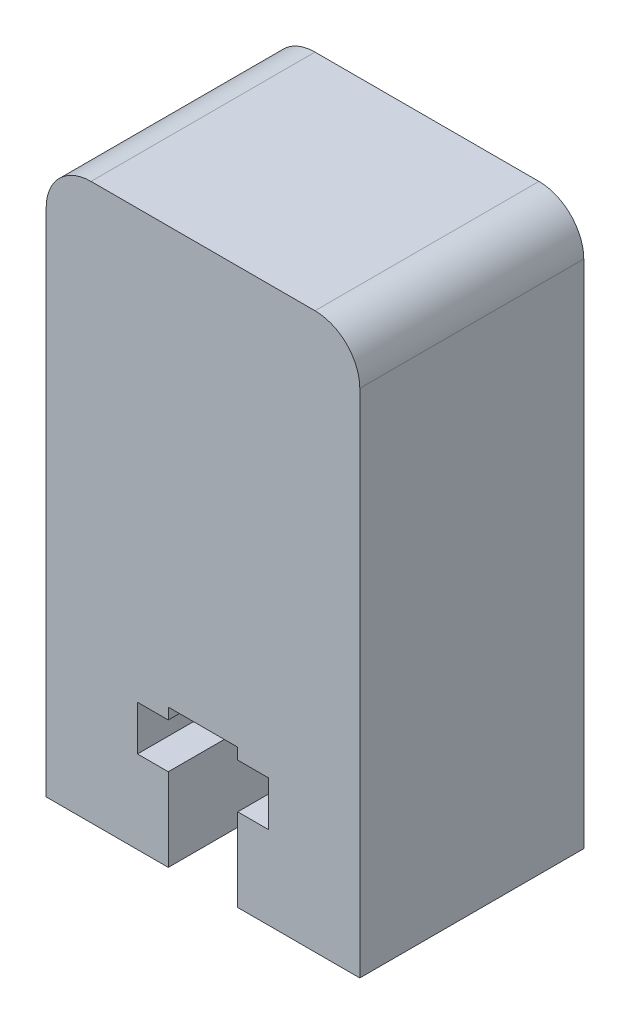
ISO-10303-21;
HEADER;
FILE_DESCRIPTION(('STEP AP214'),'2;1');
FILE_NAME('part.step','',(''),(''),'','','');
FILE_SCHEMA(('AUTOMOTIVE_DESIGN { 1 0 10303 214 1 1 1 1 }'));
ENDSEC;
DATA;
#1=APPLICATION_CONTEXT('core data for automotive mechanical design processes');
#2=APPLICATION_PROTOCOL_DEFINITION('international standard','automotive_design',2000,#1);
#3=PRODUCT_CONTEXT('',#1,'mechanical');
#4=PRODUCT('Part','Part','',(#3));
#5=PRODUCT_RELATED_PRODUCT_CATEGORY('part','',(#4));
#6=PRODUCT_DEFINITION_FORMATION('','',#4);
#7=PRODUCT_DEFINITION_CONTEXT('part definition',#1,'design');
#8=PRODUCT_DEFINITION('design','',#6,#7);
#9=PRODUCT_DEFINITION_SHAPE('','',#8);
#10=(LENGTH_UNIT() NAMED_UNIT(*) SI_UNIT(.MILLI.,.METRE.));
#11=(NAMED_UNIT(*) PLANE_ANGLE_UNIT() SI_UNIT($,.RADIAN.));
#12=(NAMED_UNIT(*) SI_UNIT($,.STERADIAN.) SOLID_ANGLE_UNIT());
#13=UNCERTAINTY_MEASURE_WITH_UNIT(LENGTH_MEASURE(1.E-05),#10,'distance_accuracy_value','');
#14=(GEOMETRIC_REPRESENTATION_CONTEXT(3) GLOBAL_UNCERTAINTY_ASSIGNED_CONTEXT((#13)) GLOBAL_UNIT_ASSIGNED_CONTEXT((#10,
#11,#12)) REPRESENTATION_CONTEXT('',''));
#15=CARTESIAN_POINT('',(0.,0.,0.));
#16=DIRECTION('',(0.,0.,1.));
#17=DIRECTION('',(1.,0.,0.));
#18=AXIS2_PLACEMENT_3D('',#15,#16,#17);
#19=CARTESIAN_POINT('',(-46.4760064902337,4.00000000000001,10.));
#20=DIRECTION('',(0.,1.,0.));
#21=DIRECTION('',(-1.,0.,0.));
#22=AXIS2_PLACEMENT_3D('',#19,#20,#21);
#23=PLANE('',#22);
#24=DIRECTION('',(1.,0.,0.));
#25=VECTOR('',#24,1.);
#26=CARTESIAN_POINT('',(-46.4760064902337,4.00000000000001,10.));
#27=LINE('',#26,#25);
#28=CARTESIAN_POINT('',(-51.9260064902337,4.00000000000001,10.));
#29=VERTEX_POINT('',#28);
#30=CARTESIAN_POINT('',(-46.4760064902337,4.00000000000001,10.));
#31=VERTEX_POINT('',#30);
#32=EDGE_CURVE('E112',#29,#31,#27,.T.);
#33=ORIENTED_EDGE('',*,*,#32,.F.);
#34=DIRECTION('',(0.,0.,1.));
#35=VECTOR('',#34,1.);
#36=CARTESIAN_POINT('',(-51.9260064902337,4.00000000000001,0.));
#37=LINE('',#36,#35);
#38=CARTESIAN_POINT('',(-51.9260064902337,4.00000000000001,0.));
#39=VERTEX_POINT('',#38);
#40=EDGE_CURVE('E138',#39,#29,#37,.T.);
#41=ORIENTED_EDGE('',*,*,#40,.F.);
#42=DIRECTION('',(1.,0.,0.));
#43=VECTOR('',#42,1.);
#44=CARTESIAN_POINT('',(-46.4760064902337,4.00000000000001,0.));
#45=LINE('',#44,#43);
#46=CARTESIAN_POINT('',(-46.4760064902337,4.00000000000001,0.));
#47=VERTEX_POINT('',#46);
#48=EDGE_CURVE('E140',#39,#47,#45,.T.);
#49=ORIENTED_EDGE('',*,*,#48,.T.);
#50=DIRECTION('',(0.,0.,-1.));
#51=VECTOR('',#50,1.);
#52=CARTESIAN_POINT('',(-46.4760064902337,4.00000000000001,10.));
#53=LINE('',#52,#51);
#54=EDGE_CURVE('E125',#31,#47,#53,.T.);
#55=ORIENTED_EDGE('',*,*,#54,.F.);
#56=EDGE_LOOP('',(#33,#41,#49,#55));
#57=FACE_BOUND('',#56,.T.);
#58=ADVANCED_FACE('F34',(#57),#23,.F.);
#59=CARTESIAN_POINT('',(-58.4760064902337,26.8,10.));
#60=DIRECTION('',(0.,0.,-1.));
#61=DIRECTION('',(-1.,0.,0.));
#62=AXIS2_PLACEMENT_3D('',#59,#60,#61);
#63=CYLINDRICAL_SURFACE('',#62,2.);
#64=CARTESIAN_POINT('',(-58.4760064902337,26.8,0.));
#65=DIRECTION('',(0.,0.,1.));
#66=DIRECTION('',(-1.,0.,0.));
#67=AXIS2_PLACEMENT_3D('',#64,#65,#66);
#68=CIRCLE('',#67,2.);
#69=CARTESIAN_POINT('',(-58.4760064902336,28.8,0.));
#70=VERTEX_POINT('',#69);
#71=CARTESIAN_POINT('',(-60.4760064902337,26.8,0.));
#72=VERTEX_POINT('',#71);
#73=EDGE_CURVE('E134',#70,#72,#68,.T.);
#74=ORIENTED_EDGE('',*,*,#73,.T.);
#75=DIRECTION('',(0.,0.,-1.));
#76=VECTOR('',#75,1.);
#77=CARTESIAN_POINT('',(-60.4760064902337,26.8,10.));
#78=LINE('',#77,#76);
#79=CARTESIAN_POINT('',(-60.4760064902337,26.8,10.));
#80=VERTEX_POINT('',#79);
#81=EDGE_CURVE('E11',#80,#72,#78,.T.);
#82=ORIENTED_EDGE('',*,*,#81,.F.);
#83=CARTESIAN_POINT('',(-58.4760064902337,26.8,10.));
#84=DIRECTION('',(0.,0.,1.));
#85=DIRECTION('',(-1.,0.,0.));
#86=AXIS2_PLACEMENT_3D('',#83,#84,#85);
#87=CIRCLE('',#86,2.);
#88=CARTESIAN_POINT('',(-58.4760064902336,28.8,10.));
#89=VERTEX_POINT('',#88);
#90=EDGE_CURVE('E148',#89,#80,#87,.T.);
#91=ORIENTED_EDGE('',*,*,#90,.F.);
#92=DIRECTION('',(0.,0.,-1.));
#93=VECTOR('',#92,1.);
#94=CARTESIAN_POINT('',(-58.4760064902336,28.8,10.));
#95=LINE('',#94,#93);
#96=EDGE_CURVE('E130',#89,#70,#95,.T.);
#97=ORIENTED_EDGE('',*,*,#96,.T.);
#98=EDGE_LOOP('',(#74,#82,#91,#97));
#99=FACE_BOUND('',#98,.T.);
#100=ADVANCED_FACE('F36',(#99),#63,.T.);
#101=CARTESIAN_POINT('',(-60.4760064902337,4.00000000000001,10.));
#102=DIRECTION('',(1.,0.,0.));
#103=DIRECTION('',(0.,0.,-1.));
#104=AXIS2_PLACEMENT_3D('',#101,#102,#103);
#105=PLANE('',#104);
#106=DIRECTION('',(0.,-1.,0.));
#107=VECTOR('',#106,1.);
#108=CARTESIAN_POINT('',(-60.4760064902337,4.00000000000001,0.));
#109=LINE('',#108,#107);
#110=CARTESIAN_POINT('',(-60.4760064902337,4.00000000000001,0.));
#111=VERTEX_POINT('',#110);
#112=EDGE_CURVE('E137',#72,#111,#109,.T.);
#113=ORIENTED_EDGE('',*,*,#112,.T.);
#114=DIRECTION('',(0.,0.,-1.));
#115=VECTOR('',#114,1.);
#116=CARTESIAN_POINT('',(-60.4760064902337,4.00000000000001,10.));
#117=LINE('',#116,#115);
#118=CARTESIAN_POINT('',(-60.4760064902337,4.00000000000001,10.));
#119=VERTEX_POINT('',#118);
#120=EDGE_CURVE('E42',#119,#111,#117,.T.);
#121=ORIENTED_EDGE('',*,*,#120,.F.);
#122=DIRECTION('',(0.,-1.,0.));
#123=VECTOR('',#122,1.);
#124=CARTESIAN_POINT('',(-60.4760064902337,4.00000000000001,10.));
#125=LINE('',#124,#123);
#126=EDGE_CURVE('E93',#80,#119,#125,.T.);
#127=ORIENTED_EDGE('',*,*,#126,.F.);
#128=ORIENTED_EDGE('',*,*,#81,.T.);
#129=EDGE_LOOP('',(#113,#121,#127,#128));
#130=FACE_BOUND('',#129,.T.);
#131=ADVANCED_FACE('F346',(#130),#105,.F.);
#132=CARTESIAN_POINT('',(-55.0260064902337,4.00000000000001,0.));
#133=VERTEX_POINT('',#132);
#134=EDGE_CURVE('E141',#111,#133,#45,.T.);
#135=ORIENTED_EDGE('',*,*,#134,.T.);
#136=DIRECTION('',(0.,0.,1.));
#137=VECTOR('',#136,1.);
#138=CARTESIAN_POINT('',(-55.0260064902337,4.00000000000001,0.));
#139=LINE('',#138,#137);
#140=CARTESIAN_POINT('',(-55.0260064902337,4.00000000000001,10.));
#141=VERTEX_POINT('',#140);
#142=EDGE_CURVE('E220',#133,#141,#139,.T.);
#143=ORIENTED_EDGE('',*,*,#142,.T.);
#144=EDGE_CURVE('E116',#119,#141,#27,.T.);
#145=ORIENTED_EDGE('',*,*,#144,.F.);
#146=ORIENTED_EDGE('',*,*,#120,.T.);
#147=EDGE_LOOP('',(#135,#143,#145,#146));
#148=FACE_BOUND('',#147,.T.);
#149=ADVANCED_FACE('F155',(#148),#23,.F.);
#150=CARTESIAN_POINT('',(-46.4760064902337,4.00000000000001,10.));
#151=DIRECTION('',(-1.,0.,0.));
#152=DIRECTION('',(0.,-1.,0.));
#153=AXIS2_PLACEMENT_3D('',#150,#151,#152);
#154=PLANE('',#153);
#155=DIRECTION('',(0.,1.,0.));
#156=VECTOR('',#155,1.);
#157=CARTESIAN_POINT('',(-46.4760064902337,4.00000000000001,0.));
#158=LINE('',#157,#156);
#159=CARTESIAN_POINT('',(-46.4760064902337,26.8,0.));
#160=VERTEX_POINT('',#159);
#161=EDGE_CURVE('E122',#47,#160,#158,.T.);
#162=ORIENTED_EDGE('',*,*,#161,.T.);
#163=DIRECTION('',(0.,0.,-1.));
#164=VECTOR('',#163,1.);
#165=CARTESIAN_POINT('',(-46.4760064902337,26.8,10.));
#166=LINE('',#165,#164);
#167=CARTESIAN_POINT('',(-46.4760064902337,26.8,10.));
#168=VERTEX_POINT('',#167);
#169=EDGE_CURVE('E119',#168,#160,#166,.T.);
#170=ORIENTED_EDGE('',*,*,#169,.F.);
#171=DIRECTION('',(0.,1.,0.));
#172=VECTOR('',#171,1.);
#173=CARTESIAN_POINT('',(-46.4760064902337,4.00000000000001,10.));
#174=LINE('',#173,#172);
#175=EDGE_CURVE('E103',#31,#168,#174,.T.);
#176=ORIENTED_EDGE('',*,*,#175,.F.);
#177=ORIENTED_EDGE('',*,*,#54,.T.);
#178=EDGE_LOOP('',(#162,#170,#176,#177));
#179=FACE_BOUND('',#178,.T.);
#180=ADVANCED_FACE('F120',(#179),#154,.F.);
#181=CARTESIAN_POINT('',(-48.4760064902337,26.8,10.));
#182=DIRECTION('',(0.,0.,-1.));
#183=DIRECTION('',(-1.,0.,0.));
#184=AXIS2_PLACEMENT_3D('',#181,#182,#183);
#185=CYLINDRICAL_SURFACE('',#184,2.);
#186=CARTESIAN_POINT('',(-48.4760064902337,26.8,0.));
#187=DIRECTION('',(0.,0.,1.));
#188=DIRECTION('',(1.,0.,0.));
#189=AXIS2_PLACEMENT_3D('',#186,#187,#188);
#190=CIRCLE('',#189,2.);
#191=CARTESIAN_POINT('',(-48.4760064902337,28.8,0.));
#192=VERTEX_POINT('',#191);
#193=EDGE_CURVE('E145',#160,#192,#190,.T.);
#194=ORIENTED_EDGE('',*,*,#193,.T.);
#195=DIRECTION('',(0.,0.,-1.));
#196=VECTOR('',#195,1.);
#197=CARTESIAN_POINT('',(-48.4760064902337,28.8,10.));
#198=LINE('',#197,#196);
#199=CARTESIAN_POINT('',(-48.4760064902337,28.8,10.));
#200=VERTEX_POINT('',#199);
#201=EDGE_CURVE('E126',#200,#192,#198,.T.);
#202=ORIENTED_EDGE('',*,*,#201,.F.);
#203=CARTESIAN_POINT('',(-48.4760064902337,26.8,10.));
#204=DIRECTION('',(0.,0.,1.));
#205=DIRECTION('',(1.,0.,0.));
#206=AXIS2_PLACEMENT_3D('',#203,#204,#205);
#207=CIRCLE('',#206,2.);
#208=EDGE_CURVE('E108',#168,#200,#207,.T.);
#209=ORIENTED_EDGE('',*,*,#208,.F.);
#210=ORIENTED_EDGE('',*,*,#169,.T.);
#211=EDGE_LOOP('',(#194,#202,#209,#210));
#212=FACE_BOUND('',#211,.T.);
#213=ADVANCED_FACE('F128',(#212),#185,.T.);
#214=CARTESIAN_POINT('',(-48.4760064902337,28.8,10.));
#215=DIRECTION('',(0.,-1.,0.));
#216=DIRECTION('',(1.,0.,0.));
#217=AXIS2_PLACEMENT_3D('',#214,#215,#216);
#218=PLANE('',#217);
#219=DIRECTION('',(-1.,0.,0.));
#220=VECTOR('',#219,1.);
#221=CARTESIAN_POINT('',(-48.4760064902337,28.8,0.));
#222=LINE('',#221,#220);
#223=EDGE_CURVE('E85',#192,#70,#222,.T.);
#224=ORIENTED_EDGE('',*,*,#223,.T.);
#225=ORIENTED_EDGE('',*,*,#96,.F.);
#226=DIRECTION('',(-1.,0.,0.));
#227=VECTOR('',#226,1.);
#228=CARTESIAN_POINT('',(-48.4760064902337,28.8,10.));
#229=LINE('',#228,#227);
#230=EDGE_CURVE('E58',#200,#89,#229,.T.);
#231=ORIENTED_EDGE('',*,*,#230,.F.);
#232=ORIENTED_EDGE('',*,*,#201,.T.);
#233=EDGE_LOOP('',(#224,#225,#231,#232));
#234=FACE_BOUND('',#233,.T.);
#235=ADVANCED_FACE('F358',(#234),#218,.F.);
#236=CARTESIAN_POINT('',(-58.4760064902337,26.8,10.));
#237=DIRECTION('',(0.,0.,-1.));
#238=DIRECTION('',(-1.,0.,0.));
#239=AXIS2_PLACEMENT_3D('',#236,#237,#238);
#240=PLANE('',#239);
#241=DIRECTION('',(1.,0.,0.));
#242=VECTOR('',#241,1.);
#243=CARTESIAN_POINT('',(-50.5510064902337,7.70000000000001,10.));
#244=LINE('',#243,#242);
#245=CARTESIAN_POINT('',(-51.9260064902337,7.70000000000001,10.));
#246=VERTEX_POINT('',#245);
#247=CARTESIAN_POINT('',(-50.5510064902337,7.70000000000001,10.));
#248=VERTEX_POINT('',#247);
#249=EDGE_CURVE('E187',#246,#248,#244,.T.);
#250=ORIENTED_EDGE('',*,*,#249,.F.);
#251=DIRECTION('',(0.,1.,0.));
#252=VECTOR('',#251,1.);
#253=CARTESIAN_POINT('',(-51.9260064902337,4.00000000000001,10.));
#254=LINE('',#253,#252);
#255=EDGE_CURVE('E184',#29,#246,#254,.T.);
#256=ORIENTED_EDGE('',*,*,#255,.F.);
#257=ORIENTED_EDGE('',*,*,#32,.T.);
#258=ORIENTED_EDGE('',*,*,#175,.T.);
#259=ORIENTED_EDGE('',*,*,#208,.T.);
#260=ORIENTED_EDGE('',*,*,#230,.T.);
#261=ORIENTED_EDGE('',*,*,#90,.T.);
#262=ORIENTED_EDGE('',*,*,#126,.T.);
#263=ORIENTED_EDGE('',*,*,#144,.T.);
#264=DIRECTION('',(0.,-1.,0.));
#265=VECTOR('',#264,1.);
#266=CARTESIAN_POINT('',(-55.0260064902337,4.00000000000001,10.));
#267=LINE('',#266,#265);
#268=CARTESIAN_POINT('',(-55.0260064902337,7.70000000000001,10.));
#269=VERTEX_POINT('',#268);
#270=EDGE_CURVE('E214',#269,#141,#267,.T.);
#271=ORIENTED_EDGE('',*,*,#270,.F.);
#272=DIRECTION('',(1.,0.,0.));
#273=VECTOR('',#272,1.);
#274=CARTESIAN_POINT('',(-55.0260064902337,7.70000000000001,10.));
#275=LINE('',#274,#273);
#276=CARTESIAN_POINT('',(-56.4010064902337,7.70000000000001,10.));
#277=VERTEX_POINT('',#276);
#278=EDGE_CURVE('E211',#277,#269,#275,.T.);
#279=ORIENTED_EDGE('',*,*,#278,.F.);
#280=DIRECTION('',(0.,-1.,0.));
#281=VECTOR('',#280,1.);
#282=CARTESIAN_POINT('',(-56.4010064902337,7.70000000000001,10.));
#283=LINE('',#282,#281);
#284=CARTESIAN_POINT('',(-56.4010064902337,9.70000000000001,10.));
#285=VERTEX_POINT('',#284);
#286=EDGE_CURVE('E208',#285,#277,#283,.T.);
#287=ORIENTED_EDGE('',*,*,#286,.F.);
#288=DIRECTION('',(-1.,0.,0.));
#289=VECTOR('',#288,1.);
#290=CARTESIAN_POINT('',(-55.0260064902337,9.70000000000001,10.));
#291=LINE('',#290,#289);
#292=CARTESIAN_POINT('',(-55.0260064902337,9.70000000000001,10.));
#293=VERTEX_POINT('',#292);
#294=EDGE_CURVE('E205',#293,#285,#291,.T.);
#295=ORIENTED_EDGE('',*,*,#294,.F.);
#296=DIRECTION('',(0.,-1.,0.));
#297=VECTOR('',#296,1.);
#298=CARTESIAN_POINT('',(-55.0260064902337,9.70000000000001,10.));
#299=LINE('',#298,#297);
#300=CARTESIAN_POINT('',(-55.0260064902337,10.2,10.));
#301=VERTEX_POINT('',#300);
#302=EDGE_CURVE('E202',#301,#293,#299,.T.);
#303=ORIENTED_EDGE('',*,*,#302,.F.);
#304=DIRECTION('',(-1.,0.,0.));
#305=VECTOR('',#304,1.);
#306=CARTESIAN_POINT('',(-51.9260064902337,10.2,10.));
#307=LINE('',#306,#305);
#308=CARTESIAN_POINT('',(-51.9260064902337,10.2,10.));
#309=VERTEX_POINT('',#308);
#310=EDGE_CURVE('E199',#309,#301,#307,.T.);
#311=ORIENTED_EDGE('',*,*,#310,.F.);
#312=DIRECTION('',(0.,1.,0.));
#313=VECTOR('',#312,1.);
#314=CARTESIAN_POINT('',(-51.9260064902337,9.70000000000001,10.));
#315=LINE('',#314,#313);
#316=CARTESIAN_POINT('',(-51.9260064902337,9.70000000000001,10.));
#317=VERTEX_POINT('',#316);
#318=EDGE_CURVE('E196',#317,#309,#315,.T.);
#319=ORIENTED_EDGE('',*,*,#318,.F.);
#320=DIRECTION('',(-1.,0.,0.));
#321=VECTOR('',#320,1.);
#322=CARTESIAN_POINT('',(-50.5510064902337,9.70000000000001,10.));
#323=LINE('',#322,#321);
#324=CARTESIAN_POINT('',(-50.5510064902337,9.70000000000001,10.));
#325=VERTEX_POINT('',#324);
#326=EDGE_CURVE('E193',#325,#317,#323,.T.);
#327=ORIENTED_EDGE('',*,*,#326,.F.);
#328=DIRECTION('',(0.,1.,0.));
#329=VECTOR('',#328,1.);
#330=CARTESIAN_POINT('',(-50.5510064902337,7.70000000000001,10.));
#331=LINE('',#330,#329);
#332=EDGE_CURVE('E190',#248,#325,#331,.T.);
#333=ORIENTED_EDGE('',*,*,#332,.F.);
#334=EDGE_LOOP('',(#250,#256,#257,#258,#259,#260,#261,#262,#263,#271,#279,#287,#295,#303,#311,
#319,#327,#333));
#335=FACE_BOUND('',#334,.T.);
#336=ADVANCED_FACE('F106',(#335),#240,.F.);
#337=CARTESIAN_POINT('',(-58.4760064902337,26.8,0.));
#338=DIRECTION('',(0.,0.,-1.));
#339=DIRECTION('',(-1.,0.,0.));
#340=AXIS2_PLACEMENT_3D('',#337,#338,#339);
#341=PLANE('',#340);
#342=DIRECTION('',(0.,1.,0.));
#343=VECTOR('',#342,1.);
#344=CARTESIAN_POINT('',(-51.9260064902337,4.00000000000001,0.));
#345=LINE('',#344,#343);
#346=CARTESIAN_POINT('',(-51.9260064902337,7.70000000000001,0.));
#347=VERTEX_POINT('',#346);
#348=EDGE_CURVE('E217',#39,#347,#345,.T.);
#349=ORIENTED_EDGE('',*,*,#348,.T.);
#350=DIRECTION('',(1.,0.,0.));
#351=VECTOR('',#350,1.);
#352=CARTESIAN_POINT('',(-50.5510064902337,7.70000000000001,0.));
#353=LINE('',#352,#351);
#354=CARTESIAN_POINT('',(-50.5510064902337,7.70000000000001,0.));
#355=VERTEX_POINT('',#354);
#356=EDGE_CURVE('E303',#347,#355,#353,.T.);
#357=ORIENTED_EDGE('',*,*,#356,.T.);
#358=DIRECTION('',(0.,1.,0.));
#359=VECTOR('',#358,1.);
#360=CARTESIAN_POINT('',(-50.5510064902337,7.70000000000001,0.));
#361=LINE('',#360,#359);
#362=CARTESIAN_POINT('',(-50.5510064902337,9.70000000000001,0.));
#363=VERTEX_POINT('',#362);
#364=EDGE_CURVE('E49',#355,#363,#361,.T.);
#365=ORIENTED_EDGE('',*,*,#364,.T.);
#366=DIRECTION('',(-1.,0.,0.));
#367=VECTOR('',#366,1.);
#368=CARTESIAN_POINT('',(-50.5510064902337,9.70000000000001,0.));
#369=LINE('',#368,#367);
#370=CARTESIAN_POINT('',(-51.9260064902337,9.70000000000001,0.));
#371=VERTEX_POINT('',#370);
#372=EDGE_CURVE('E310',#363,#371,#369,.T.);
#373=ORIENTED_EDGE('',*,*,#372,.T.);
#374=DIRECTION('',(0.,1.,0.));
#375=VECTOR('',#374,1.);
#376=CARTESIAN_POINT('',(-51.9260064902337,9.70000000000001,0.));
#377=LINE('',#376,#375);
#378=CARTESIAN_POINT('',(-51.9260064902337,10.2,0.));
#379=VERTEX_POINT('',#378);
#380=EDGE_CURVE('E313',#371,#379,#377,.T.);
#381=ORIENTED_EDGE('',*,*,#380,.T.);
#382=DIRECTION('',(-1.,0.,0.));
#383=VECTOR('',#382,1.);
#384=CARTESIAN_POINT('',(-51.9260064902337,10.2,0.));
#385=LINE('',#384,#383);
#386=CARTESIAN_POINT('',(-55.0260064902337,10.2,0.));
#387=VERTEX_POINT('',#386);
#388=EDGE_CURVE('E316',#379,#387,#385,.T.);
#389=ORIENTED_EDGE('',*,*,#388,.T.);
#390=DIRECTION('',(0.,-1.,0.));
#391=VECTOR('',#390,1.);
#392=CARTESIAN_POINT('',(-55.0260064902337,9.70000000000001,0.));
#393=LINE('',#392,#391);
#394=CARTESIAN_POINT('',(-55.0260064902337,9.70000000000001,0.));
#395=VERTEX_POINT('',#394);
#396=EDGE_CURVE('E319',#387,#395,#393,.T.);
#397=ORIENTED_EDGE('',*,*,#396,.T.);
#398=DIRECTION('',(-1.,0.,0.));
#399=VECTOR('',#398,1.);
#400=CARTESIAN_POINT('',(-55.0260064902337,9.70000000000001,0.));
#401=LINE('',#400,#399);
#402=CARTESIAN_POINT('',(-56.4010064902337,9.70000000000001,0.));
#403=VERTEX_POINT('',#402);
#404=EDGE_CURVE('E322',#395,#403,#401,.T.);
#405=ORIENTED_EDGE('',*,*,#404,.T.);
#406=DIRECTION('',(0.,-1.,0.));
#407=VECTOR('',#406,1.);
#408=CARTESIAN_POINT('',(-56.4010064902337,7.70000000000001,0.));
#409=LINE('',#408,#407);
#410=CARTESIAN_POINT('',(-56.4010064902337,7.70000000000001,0.));
#411=VERTEX_POINT('',#410);
#412=EDGE_CURVE('E180',#403,#411,#409,.T.);
#413=ORIENTED_EDGE('',*,*,#412,.T.);
#414=DIRECTION('',(1.,0.,0.));
#415=VECTOR('',#414,1.);
#416=CARTESIAN_POINT('',(-55.0260064902337,7.70000000000001,0.));
#417=LINE('',#416,#415);
#418=CARTESIAN_POINT('',(-55.0260064902337,7.70000000000001,0.));
#419=VERTEX_POINT('',#418);
#420=EDGE_CURVE('E170',#411,#419,#417,.T.);
#421=ORIENTED_EDGE('',*,*,#420,.T.);
#422=DIRECTION('',(0.,-1.,0.));
#423=VECTOR('',#422,1.);
#424=CARTESIAN_POINT('',(-55.0260064902337,4.00000000000001,0.));
#425=LINE('',#424,#423);
#426=EDGE_CURVE('E166',#419,#133,#425,.T.);
#427=ORIENTED_EDGE('',*,*,#426,.T.);
#428=ORIENTED_EDGE('',*,*,#134,.F.);
#429=ORIENTED_EDGE('',*,*,#112,.F.);
#430=ORIENTED_EDGE('',*,*,#73,.F.);
#431=ORIENTED_EDGE('',*,*,#223,.F.);
#432=ORIENTED_EDGE('',*,*,#193,.F.);
#433=ORIENTED_EDGE('',*,*,#161,.F.);
#434=ORIENTED_EDGE('',*,*,#48,.F.);
#435=EDGE_LOOP('',(#349,#357,#365,#373,#381,#389,#397,#405,#413,#421,#427,#428,#429,#430,#431,
#432,#433,#434));
#436=FACE_BOUND('',#435,.T.);
#437=ADVANCED_FACE('F162',(#436),#341,.T.);
#438=CARTESIAN_POINT('',(-51.9260064902337,4.00000000000001,0.));
#439=DIRECTION('',(1.,0.,0.));
#440=DIRECTION('',(0.,0.,-1.));
#441=AXIS2_PLACEMENT_3D('',#438,#439,#440);
#442=PLANE('',#441);
#443=ORIENTED_EDGE('',*,*,#255,.T.);
#444=DIRECTION('',(0.,0.,1.));
#445=VECTOR('',#444,1.);
#446=CARTESIAN_POINT('',(-51.9260064902337,7.70000000000001,0.));
#447=LINE('',#446,#445);
#448=EDGE_CURVE('E175',#347,#246,#447,.T.);
#449=ORIENTED_EDGE('',*,*,#448,.F.);
#450=ORIENTED_EDGE('',*,*,#348,.F.);
#451=ORIENTED_EDGE('',*,*,#40,.T.);
#452=EDGE_LOOP('',(#443,#449,#450,#451));
#453=FACE_BOUND('',#452,.T.);
#454=ADVANCED_FACE('F299',(#453),#442,.F.);
#455=CARTESIAN_POINT('',(-55.0260064902337,4.00000000000001,0.));
#456=DIRECTION('',(-1.,0.,0.));
#457=DIRECTION('',(0.,0.,1.));
#458=AXIS2_PLACEMENT_3D('',#455,#456,#457);
#459=PLANE('',#458);
#460=ORIENTED_EDGE('',*,*,#270,.T.);
#461=ORIENTED_EDGE('',*,*,#142,.F.);
#462=ORIENTED_EDGE('',*,*,#426,.F.);
#463=DIRECTION('',(0.,0.,1.));
#464=VECTOR('',#463,1.);
#465=CARTESIAN_POINT('',(-55.0260064902337,7.70000000000001,0.));
#466=LINE('',#465,#464);
#467=EDGE_CURVE('E222',#419,#269,#466,.T.);
#468=ORIENTED_EDGE('',*,*,#467,.T.);
#469=EDGE_LOOP('',(#460,#461,#462,#468));
#470=FACE_BOUND('',#469,.T.);
#471=ADVANCED_FACE('F331',(#470),#459,.F.);
#472=CARTESIAN_POINT('',(-55.0260064902337,7.70000000000001,0.));
#473=DIRECTION('',(0.,-1.,0.));
#474=DIRECTION('',(0.,0.,-1.));
#475=AXIS2_PLACEMENT_3D('',#472,#473,#474);
#476=PLANE('',#475);
#477=ORIENTED_EDGE('',*,*,#278,.T.);
#478=ORIENTED_EDGE('',*,*,#467,.F.);
#479=ORIENTED_EDGE('',*,*,#420,.F.);
#480=DIRECTION('',(0.,0.,1.));
#481=VECTOR('',#480,1.);
#482=CARTESIAN_POINT('',(-56.4010064902337,7.70000000000001,0.));
#483=LINE('',#482,#481);
#484=EDGE_CURVE('E224',#411,#277,#483,.T.);
#485=ORIENTED_EDGE('',*,*,#484,.T.);
#486=EDGE_LOOP('',(#477,#478,#479,#485));
#487=FACE_BOUND('',#486,.T.);
#488=ADVANCED_FACE('F330',(#487),#476,.F.);
#489=CARTESIAN_POINT('',(-56.4010064902337,7.70000000000001,0.));
#490=DIRECTION('',(-1.,0.,0.));
#491=DIRECTION('',(0.,0.,1.));
#492=AXIS2_PLACEMENT_3D('',#489,#490,#491);
#493=PLANE('',#492);
#494=ORIENTED_EDGE('',*,*,#286,.T.);
#495=ORIENTED_EDGE('',*,*,#484,.F.);
#496=ORIENTED_EDGE('',*,*,#412,.F.);
#497=DIRECTION('',(0.,0.,1.));
#498=VECTOR('',#497,1.);
#499=CARTESIAN_POINT('',(-56.4010064902337,9.70000000000001,0.));
#500=LINE('',#499,#498);
#501=EDGE_CURVE('E227',#403,#285,#500,.T.);
#502=ORIENTED_EDGE('',*,*,#501,.T.);
#503=EDGE_LOOP('',(#494,#495,#496,#502));
#504=FACE_BOUND('',#503,.T.);
#505=ADVANCED_FACE('F327',(#504),#493,.F.);
#506=CARTESIAN_POINT('',(-55.0260064902337,9.70000000000001,0.));
#507=DIRECTION('',(0.,1.,0.));
#508=DIRECTION('',(0.,0.,1.));
#509=AXIS2_PLACEMENT_3D('',#506,#507,#508);
#510=PLANE('',#509);
#511=ORIENTED_EDGE('',*,*,#294,.T.);
#512=ORIENTED_EDGE('',*,*,#501,.F.);
#513=ORIENTED_EDGE('',*,*,#404,.F.);
#514=DIRECTION('',(0.,0.,1.));
#515=VECTOR('',#514,1.);
#516=CARTESIAN_POINT('',(-55.0260064902337,9.70000000000001,0.));
#517=LINE('',#516,#515);
#518=EDGE_CURVE('E230',#395,#293,#517,.T.);
#519=ORIENTED_EDGE('',*,*,#518,.T.);
#520=EDGE_LOOP('',(#511,#512,#513,#519));
#521=FACE_BOUND('',#520,.T.);
#522=ADVANCED_FACE('F390',(#521),#510,.F.);
#523=CARTESIAN_POINT('',(-55.0260064902337,9.70000000000001,0.));
#524=DIRECTION('',(-1.,0.,0.));
#525=DIRECTION('',(0.,0.,1.));
#526=AXIS2_PLACEMENT_3D('',#523,#524,#525);
#527=PLANE('',#526);
#528=ORIENTED_EDGE('',*,*,#302,.T.);
#529=ORIENTED_EDGE('',*,*,#518,.F.);
#530=ORIENTED_EDGE('',*,*,#396,.F.);
#531=DIRECTION('',(0.,0.,1.));
#532=VECTOR('',#531,1.);
#533=CARTESIAN_POINT('',(-55.0260064902337,10.2,0.));
#534=LINE('',#533,#532);
#535=EDGE_CURVE('E233',#387,#301,#534,.T.);
#536=ORIENTED_EDGE('',*,*,#535,.T.);
#537=EDGE_LOOP('',(#528,#529,#530,#536));
#538=FACE_BOUND('',#537,.T.);
#539=ADVANCED_FACE('F386',(#538),#527,.F.);
#540=CARTESIAN_POINT('',(-51.9260064902337,10.2,0.));
#541=DIRECTION('',(0.,1.,0.));
#542=DIRECTION('',(0.,0.,1.));
#543=AXIS2_PLACEMENT_3D('',#540,#541,#542);
#544=PLANE('',#543);
#545=ORIENTED_EDGE('',*,*,#310,.T.);
#546=ORIENTED_EDGE('',*,*,#535,.F.);
#547=ORIENTED_EDGE('',*,*,#388,.F.);
#548=DIRECTION('',(0.,0.,1.));
#549=VECTOR('',#548,1.);
#550=CARTESIAN_POINT('',(-51.9260064902337,10.2,0.));
#551=LINE('',#550,#549);
#552=EDGE_CURVE('E236',#379,#309,#551,.T.);
#553=ORIENTED_EDGE('',*,*,#552,.T.);
#554=EDGE_LOOP('',(#545,#546,#547,#553));
#555=FACE_BOUND('',#554,.T.);
#556=ADVANCED_FACE('F382',(#555),#544,.F.);
#557=CARTESIAN_POINT('',(-51.9260064902337,9.70000000000001,0.));
#558=DIRECTION('',(1.,0.,0.));
#559=DIRECTION('',(0.,0.,-1.));
#560=AXIS2_PLACEMENT_3D('',#557,#558,#559);
#561=PLANE('',#560);
#562=ORIENTED_EDGE('',*,*,#318,.T.);
#563=ORIENTED_EDGE('',*,*,#552,.F.);
#564=ORIENTED_EDGE('',*,*,#380,.F.);
#565=DIRECTION('',(0.,0.,1.));
#566=VECTOR('',#565,1.);
#567=CARTESIAN_POINT('',(-51.9260064902337,9.70000000000001,0.));
#568=LINE('',#567,#566);
#569=EDGE_CURVE('E239',#371,#317,#568,.T.);
#570=ORIENTED_EDGE('',*,*,#569,.T.);
#571=EDGE_LOOP('',(#562,#563,#564,#570));
#572=FACE_BOUND('',#571,.T.);
#573=ADVANCED_FACE('F378',(#572),#561,.F.);
#574=CARTESIAN_POINT('',(-50.5510064902337,9.70000000000001,0.));
#575=DIRECTION('',(0.,1.,0.));
#576=DIRECTION('',(-1.,0.,0.));
#577=AXIS2_PLACEMENT_3D('',#574,#575,#576);
#578=PLANE('',#577);
#579=ORIENTED_EDGE('',*,*,#326,.T.);
#580=ORIENTED_EDGE('',*,*,#569,.F.);
#581=ORIENTED_EDGE('',*,*,#372,.F.);
#582=DIRECTION('',(0.,0.,1.));
#583=VECTOR('',#582,1.);
#584=CARTESIAN_POINT('',(-50.5510064902337,9.70000000000001,0.));
#585=LINE('',#584,#583);
#586=EDGE_CURVE('E242',#363,#325,#585,.T.);
#587=ORIENTED_EDGE('',*,*,#586,.T.);
#588=EDGE_LOOP('',(#579,#580,#581,#587));
#589=FACE_BOUND('',#588,.T.);
#590=ADVANCED_FACE('F375',(#589),#578,.F.);
#591=CARTESIAN_POINT('',(-50.5510064902337,7.70000000000001,0.));
#592=DIRECTION('',(1.,0.,0.));
#593=DIRECTION('',(0.,0.,-1.));
#594=AXIS2_PLACEMENT_3D('',#591,#592,#593);
#595=PLANE('',#594);
#596=ORIENTED_EDGE('',*,*,#332,.T.);
#597=ORIENTED_EDGE('',*,*,#586,.F.);
#598=ORIENTED_EDGE('',*,*,#364,.F.);
#599=DIRECTION('',(0.,0.,1.));
#600=VECTOR('',#599,1.);
#601=CARTESIAN_POINT('',(-50.5510064902337,7.70000000000001,0.));
#602=LINE('',#601,#600);
#603=EDGE_CURVE('E178',#355,#248,#602,.T.);
#604=ORIENTED_EDGE('',*,*,#603,.T.);
#605=EDGE_LOOP('',(#596,#597,#598,#604));
#606=FACE_BOUND('',#605,.T.);
#607=ADVANCED_FACE('F372',(#606),#595,.F.);
#608=CARTESIAN_POINT('',(-50.5510064902337,7.70000000000001,0.));
#609=DIRECTION('',(0.,-1.,0.));
#610=DIRECTION('',(0.,0.,-1.));
#611=AXIS2_PLACEMENT_3D('',#608,#609,#610);
#612=PLANE('',#611);
#613=ORIENTED_EDGE('',*,*,#249,.T.);
#614=ORIENTED_EDGE('',*,*,#603,.F.);
#615=ORIENTED_EDGE('',*,*,#356,.F.);
#616=ORIENTED_EDGE('',*,*,#448,.T.);
#617=EDGE_LOOP('',(#613,#614,#615,#616));
#618=FACE_BOUND('',#617,.T.);
#619=ADVANCED_FACE('F304',(#618),#612,.F.);
#620=CLOSED_SHELL('',(#58,#100,#131,#149,#180,#213,#235,#336,#437,#454,#471,#488,#505,#522,#539,
#556,#573,#590,#607,#619));
#621=MANIFOLD_SOLID_BREP('B2',#620);
#622=ADVANCED_BREP_SHAPE_REPRESENTATION('',(#18,#621),#14);
#623=SHAPE_DEFINITION_REPRESENTATION(#9,#622);
ENDSEC;
END-ISO-10303-21;
